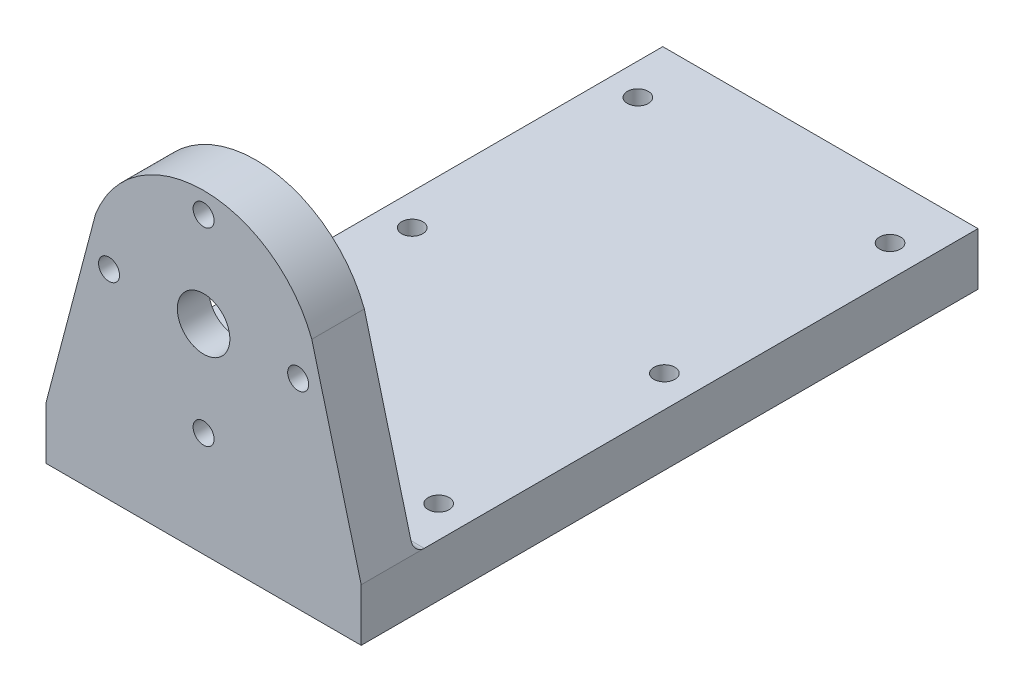
ISO-10303-21;
HEADER;
FILE_DESCRIPTION(('STEP AP214'),'2;1');
FILE_NAME('part.step','',(''),(''),'','','');
FILE_SCHEMA(('AUTOMOTIVE_DESIGN { 1 0 10303 214 1 1 1 1 }'));
ENDSEC;
DATA;
#1=APPLICATION_CONTEXT('core data for automotive mechanical design processes');
#2=APPLICATION_PROTOCOL_DEFINITION('international standard','automotive_design',2000,#1);
#3=PRODUCT_CONTEXT('',#1,'mechanical');
#4=PRODUCT('Part','Part','',(#3));
#5=PRODUCT_RELATED_PRODUCT_CATEGORY('part','',(#4));
#6=PRODUCT_DEFINITION_FORMATION('','',#4);
#7=PRODUCT_DEFINITION_CONTEXT('part definition',#1,'design');
#8=PRODUCT_DEFINITION('design','',#6,#7);
#9=PRODUCT_DEFINITION_SHAPE('','',#8);
#10=(LENGTH_UNIT() NAMED_UNIT(*) SI_UNIT(.MILLI.,.METRE.));
#11=(NAMED_UNIT(*) PLANE_ANGLE_UNIT() SI_UNIT($,.RADIAN.));
#12=(NAMED_UNIT(*) SI_UNIT($,.STERADIAN.) SOLID_ANGLE_UNIT());
#13=UNCERTAINTY_MEASURE_WITH_UNIT(LENGTH_MEASURE(1.E-05),#10,'distance_accuracy_value','');
#14=(GEOMETRIC_REPRESENTATION_CONTEXT(3) GLOBAL_UNCERTAINTY_ASSIGNED_CONTEXT((#13)) GLOBAL_UNIT_ASSIGNED_CONTEXT((#10,
#11,#12)) REPRESENTATION_CONTEXT('',''));
#15=CARTESIAN_POINT('',(0.,0.,0.));
#16=DIRECTION('',(0.,0.,1.));
#17=DIRECTION('',(1.,0.,0.));
#18=AXIS2_PLACEMENT_3D('',#15,#16,#17);
#19=CARTESIAN_POINT('',(15.,19.,-58.7));
#20=DIRECTION('',(0.,0.,1.));
#21=DIRECTION('',(1.,0.,0.));
#22=AXIS2_PLACEMENT_3D('',#19,#20,#21);
#23=CYLINDRICAL_SURFACE('',#22,2.5);
#24=CARTESIAN_POINT('',(15.,19.,0.));
#25=DIRECTION('',(0.,0.,1.));
#26=DIRECTION('',(1.,0.,0.));
#27=AXIS2_PLACEMENT_3D('',#24,#25,#26);
#28=CIRCLE('',#27,2.5);
#29=CARTESIAN_POINT('',(17.5,19.,0.));
#30=VERTEX_POINT('',#29);
#31=EDGE_CURVE('E260',#30,#30,#28,.T.);
#32=ORIENTED_EDGE('',*,*,#31,.T.);
#33=EDGE_LOOP('',(#32));
#34=FACE_BOUND('',#33,.T.);
#35=CARTESIAN_POINT('',(15.,19.,-3.));
#36=DIRECTION('',(0.,0.,-1.));
#37=DIRECTION('',(0.,1.,0.));
#38=AXIS2_PLACEMENT_3D('',#35,#36,#37);
#39=CIRCLE('',#38,2.5);
#40=CARTESIAN_POINT('',(15.,21.5,-3.));
#41=VERTEX_POINT('',#40);
#42=EDGE_CURVE('E308',#41,#41,#39,.F.);
#43=ORIENTED_EDGE('',*,*,#42,.F.);
#44=EDGE_LOOP('',(#43));
#45=FACE_BOUND('',#44,.T.);
#46=ADVANCED_FACE('F179',(#34,#45),#23,.F.);
#47=CARTESIAN_POINT('',(30.,0.,-58.7));
#48=DIRECTION('',(0.,1.,0.));
#49=DIRECTION('',(0.,0.,1.));
#50=AXIS2_PLACEMENT_3D('',#47,#48,#49);
#51=PLANE('',#50);
#52=CARTESIAN_POINT('',(27.,0.,-31.85));
#53=DIRECTION('',(0.,1.,0.));
#54=DIRECTION('',(0.,0.,-1.));
#55=AXIS2_PLACEMENT_3D('',#52,#53,#54);
#56=CIRCLE('',#55,0.999999999999998);
#57=CARTESIAN_POINT('',(27.,0.,-32.85));
#58=VERTEX_POINT('',#57);
#59=EDGE_CURVE('E423',#58,#58,#56,.T.);
#60=ORIENTED_EDGE('',*,*,#59,.T.);
#61=EDGE_LOOP('',(#60));
#62=FACE_BOUND('',#61,.T.);
#63=CARTESIAN_POINT('',(3.,0.,-31.85));
#64=DIRECTION('',(0.,1.,0.));
#65=DIRECTION('',(0.,0.,1.));
#66=AXIS2_PLACEMENT_3D('',#63,#64,#65);
#67=CIRCLE('',#66,0.999999999999999);
#68=CARTESIAN_POINT('',(3.,0.,-30.85));
#69=VERTEX_POINT('',#68);
#70=EDGE_CURVE('E431',#69,#69,#67,.T.);
#71=ORIENTED_EDGE('',*,*,#70,.T.);
#72=EDGE_LOOP('',(#71));
#73=FACE_BOUND('',#72,.T.);
#74=CARTESIAN_POINT('',(3.,0.,-53.33));
#75=DIRECTION('',(0.,1.,0.));
#76=DIRECTION('',(0.,0.,-1.));
#77=AXIS2_PLACEMENT_3D('',#74,#75,#76);
#78=CIRCLE('',#77,1.);
#79=CARTESIAN_POINT('',(3.,0.,-54.33));
#80=VERTEX_POINT('',#79);
#81=EDGE_CURVE('E437',#80,#80,#78,.T.);
#82=ORIENTED_EDGE('',*,*,#81,.T.);
#83=EDGE_LOOP('',(#82));
#84=FACE_BOUND('',#83,.T.);
#85=CARTESIAN_POINT('',(27.,0.,-53.33));
#86=DIRECTION('',(0.,1.,0.));
#87=DIRECTION('',(0.,0.,1.));
#88=AXIS2_PLACEMENT_3D('',#85,#86,#87);
#89=CIRCLE('',#88,0.999999999999998);
#90=CARTESIAN_POINT('',(27.,0.,-52.33));
#91=VERTEX_POINT('',#90);
#92=EDGE_CURVE('E443',#91,#91,#89,.T.);
#93=ORIENTED_EDGE('',*,*,#92,.T.);
#94=EDGE_LOOP('',(#93));
#95=FACE_BOUND('',#94,.T.);
#96=CARTESIAN_POINT('',(27.,0.,-10.37));
#97=DIRECTION('',(0.,1.,0.));
#98=DIRECTION('',(0.,0.,-1.));
#99=AXIS2_PLACEMENT_3D('',#96,#97,#98);
#100=CIRCLE('',#99,0.999999999999998);
#101=CARTESIAN_POINT('',(27.,0.,-11.37));
#102=VERTEX_POINT('',#101);
#103=EDGE_CURVE('E449',#102,#102,#100,.T.);
#104=ORIENTED_EDGE('',*,*,#103,.T.);
#105=EDGE_LOOP('',(#104));
#106=FACE_BOUND('',#105,.T.);
#107=CARTESIAN_POINT('',(3.,0.,-10.37));
#108=DIRECTION('',(0.,1.,0.));
#109=DIRECTION('',(0.,0.,1.));
#110=AXIS2_PLACEMENT_3D('',#107,#108,#109);
#111=CIRCLE('',#110,1.);
#112=CARTESIAN_POINT('',(3.,0.,-9.37));
#113=VERTEX_POINT('',#112);
#114=EDGE_CURVE('E455',#113,#113,#111,.T.);
#115=ORIENTED_EDGE('',*,*,#114,.T.);
#116=EDGE_LOOP('',(#115));
#117=FACE_BOUND('',#116,.T.);
#118=DIRECTION('',(0.,0.,-1.));
#119=VECTOR('',#118,1.);
#120=CARTESIAN_POINT('',(0.,0.,-58.7));
#121=LINE('',#120,#119);
#122=CARTESIAN_POINT('',(0.,0.,0.));
#123=VERTEX_POINT('',#122);
#124=CARTESIAN_POINT('',(0.,0.,-58.7));
#125=VERTEX_POINT('',#124);
#126=EDGE_CURVE('E277',#123,#125,#121,.T.);
#127=ORIENTED_EDGE('',*,*,#126,.T.);
#128=DIRECTION('',(-1.,0.,0.));
#129=VECTOR('',#128,1.);
#130=CARTESIAN_POINT('',(30.,0.,-58.7));
#131=LINE('',#130,#129);
#132=CARTESIAN_POINT('',(30.,0.,-58.7));
#133=VERTEX_POINT('',#132);
#134=EDGE_CURVE('E301',#133,#125,#131,.T.);
#135=ORIENTED_EDGE('',*,*,#134,.F.);
#136=DIRECTION('',(0.,0.,-1.));
#137=VECTOR('',#136,1.);
#138=CARTESIAN_POINT('',(30.,0.,-58.7));
#139=LINE('',#138,#137);
#140=CARTESIAN_POINT('',(30.,0.,0.));
#141=VERTEX_POINT('',#140);
#142=EDGE_CURVE('E278',#141,#133,#139,.T.);
#143=ORIENTED_EDGE('',*,*,#142,.F.);
#144=DIRECTION('',(-1.,0.,0.));
#145=VECTOR('',#144,1.);
#146=CARTESIAN_POINT('',(30.,0.,0.));
#147=LINE('',#146,#145);
#148=EDGE_CURVE('E288',#141,#123,#147,.T.);
#149=ORIENTED_EDGE('',*,*,#148,.T.);
#150=EDGE_LOOP('',(#127,#135,#143,#149));
#151=FACE_BOUND('',#150,.T.);
#152=ADVANCED_FACE('F338',(#62,#73,#84,#95,#106,#117,#151),#51,.F.);
#153=CARTESIAN_POINT('',(30.,5.,-58.7));
#154=DIRECTION('',(0.,0.,1.));
#155=DIRECTION('',(1.,0.,0.));
#156=AXIS2_PLACEMENT_3D('',#153,#154,#155);
#157=PLANE('',#156);
#158=DIRECTION('',(0.,1.,0.));
#159=VECTOR('',#158,1.);
#160=CARTESIAN_POINT('',(0.,5.,-58.7));
#161=LINE('',#160,#159);
#162=CARTESIAN_POINT('',(0.,5.,-58.7));
#163=VERTEX_POINT('',#162);
#164=EDGE_CURVE('E291',#125,#163,#161,.T.);
#165=ORIENTED_EDGE('',*,*,#164,.T.);
#166=DIRECTION('',(-1.,0.,0.));
#167=VECTOR('',#166,1.);
#168=CARTESIAN_POINT('',(30.,5.,-58.7));
#169=LINE('',#168,#167);
#170=CARTESIAN_POINT('',(30.,5.,-58.7));
#171=VERTEX_POINT('',#170);
#172=EDGE_CURVE('E298',#171,#163,#169,.T.);
#173=ORIENTED_EDGE('',*,*,#172,.F.);
#174=DIRECTION('',(0.,1.,0.));
#175=VECTOR('',#174,1.);
#176=CARTESIAN_POINT('',(30.,5.,-58.7));
#177=LINE('',#176,#175);
#178=EDGE_CURVE('E281',#133,#171,#177,.T.);
#179=ORIENTED_EDGE('',*,*,#178,.F.);
#180=ORIENTED_EDGE('',*,*,#134,.T.);
#181=EDGE_LOOP('',(#165,#173,#179,#180));
#182=FACE_BOUND('',#181,.T.);
#183=ADVANCED_FACE('F334',(#182),#157,.F.);
#184=CARTESIAN_POINT('',(30.,5.,-5.));
#185=DIRECTION('',(0.,-1.,0.));
#186=DIRECTION('',(0.,0.,-1.));
#187=AXIS2_PLACEMENT_3D('',#184,#185,#186);
#188=PLANE('',#187);
#189=CARTESIAN_POINT('',(27.,5.,-31.85));
#190=DIRECTION('',(0.,1.,0.));
#191=DIRECTION('',(0.,0.,-1.));
#192=AXIS2_PLACEMENT_3D('',#189,#190,#191);
#193=CIRCLE('',#192,0.999999999999998);
#194=CARTESIAN_POINT('',(27.,5.,-32.85));
#195=VERTEX_POINT('',#194);
#196=EDGE_CURVE('E426',#195,#195,#193,.T.);
#197=ORIENTED_EDGE('',*,*,#196,.F.);
#198=EDGE_LOOP('',(#197));
#199=FACE_BOUND('',#198,.T.);
#200=CARTESIAN_POINT('',(3.,5.,-31.85));
#201=DIRECTION('',(0.,1.,0.));
#202=DIRECTION('',(0.,0.,1.));
#203=AXIS2_PLACEMENT_3D('',#200,#201,#202);
#204=CIRCLE('',#203,0.999999999999999);
#205=CARTESIAN_POINT('',(3.,5.,-30.85));
#206=VERTEX_POINT('',#205);
#207=EDGE_CURVE('E428',#206,#206,#204,.T.);
#208=ORIENTED_EDGE('',*,*,#207,.F.);
#209=EDGE_LOOP('',(#208));
#210=FACE_BOUND('',#209,.T.);
#211=CARTESIAN_POINT('',(3.,5.,-53.33));
#212=DIRECTION('',(0.,1.,0.));
#213=DIRECTION('',(0.,0.,-1.));
#214=AXIS2_PLACEMENT_3D('',#211,#212,#213);
#215=CIRCLE('',#214,1.);
#216=CARTESIAN_POINT('',(3.,5.,-54.33));
#217=VERTEX_POINT('',#216);
#218=EDGE_CURVE('E434',#217,#217,#215,.T.);
#219=ORIENTED_EDGE('',*,*,#218,.F.);
#220=EDGE_LOOP('',(#219));
#221=FACE_BOUND('',#220,.T.);
#222=CARTESIAN_POINT('',(27.,5.,-53.33));
#223=DIRECTION('',(0.,1.,0.));
#224=DIRECTION('',(0.,0.,1.));
#225=AXIS2_PLACEMENT_3D('',#222,#223,#224);
#226=CIRCLE('',#225,0.999999999999998);
#227=CARTESIAN_POINT('',(27.,5.,-52.33));
#228=VERTEX_POINT('',#227);
#229=EDGE_CURVE('E440',#228,#228,#226,.T.);
#230=ORIENTED_EDGE('',*,*,#229,.F.);
#231=EDGE_LOOP('',(#230));
#232=FACE_BOUND('',#231,.T.);
#233=CARTESIAN_POINT('',(27.,5.,-10.37));
#234=DIRECTION('',(0.,1.,0.));
#235=DIRECTION('',(0.,0.,-1.));
#236=AXIS2_PLACEMENT_3D('',#233,#234,#235);
#237=CIRCLE('',#236,0.999999999999998);
#238=CARTESIAN_POINT('',(27.,5.,-11.37));
#239=VERTEX_POINT('',#238);
#240=EDGE_CURVE('E446',#239,#239,#237,.T.);
#241=ORIENTED_EDGE('',*,*,#240,.F.);
#242=EDGE_LOOP('',(#241));
#243=FACE_BOUND('',#242,.T.);
#244=CARTESIAN_POINT('',(3.,5.,-10.37));
#245=DIRECTION('',(0.,1.,0.));
#246=DIRECTION('',(0.,0.,1.));
#247=AXIS2_PLACEMENT_3D('',#244,#245,#246);
#248=CIRCLE('',#247,1.);
#249=CARTESIAN_POINT('',(3.,5.,-9.37));
#250=VERTEX_POINT('',#249);
#251=EDGE_CURVE('E452',#250,#250,#248,.T.);
#252=ORIENTED_EDGE('',*,*,#251,.F.);
#253=EDGE_LOOP('',(#252));
#254=FACE_BOUND('',#253,.T.);
#255=DIRECTION('',(0.,0.,1.));
#256=VECTOR('',#255,1.);
#257=CARTESIAN_POINT('',(0.,5.,-5.));
#258=LINE('',#257,#256);
#259=CARTESIAN_POINT('',(0.,5.,-6.));
#260=VERTEX_POINT('',#259);
#261=EDGE_CURVE('E293',#163,#260,#258,.T.);
#262=ORIENTED_EDGE('',*,*,#261,.T.);
#263=DIRECTION('',(-1.,0.,0.));
#264=VECTOR('',#263,1.);
#265=CARTESIAN_POINT('',(30.,5.,-6.));
#266=LINE('',#265,#264);
#267=CARTESIAN_POINT('',(30.,4.99999999999999,-6.));
#268=VERTEX_POINT('',#267);
#269=EDGE_CURVE('E315',#260,#268,#266,.F.);
#270=ORIENTED_EDGE('',*,*,#269,.T.);
#271=DIRECTION('',(0.,0.,1.));
#272=VECTOR('',#271,1.);
#273=CARTESIAN_POINT('',(30.,5.,-5.));
#274=LINE('',#273,#272);
#275=EDGE_CURVE('E284',#171,#268,#274,.T.);
#276=ORIENTED_EDGE('',*,*,#275,.F.);
#277=ORIENTED_EDGE('',*,*,#172,.T.);
#278=EDGE_LOOP('',(#262,#270,#276,#277));
#279=FACE_BOUND('',#278,.T.);
#280=ADVANCED_FACE('F327',(#199,#210,#221,#232,#243,#254,#279),#188,.F.);
#281=CARTESIAN_POINT('',(30.,30.,-5.));
#282=DIRECTION('',(0.,0.,1.));
#283=DIRECTION('',(0.,-1.,0.));
#284=AXIS2_PLACEMENT_3D('',#281,#282,#283);
#285=PLANE('',#284);
#286=CARTESIAN_POINT('',(15.,19.,-5.));
#287=DIRECTION('',(0.,0.,-1.));
#288=DIRECTION('',(0.,1.,0.));
#289=AXIS2_PLACEMENT_3D('',#286,#287,#288);
#290=CIRCLE('',#289,7.);
#291=CARTESIAN_POINT('',(15.,26.,-5.));
#292=VERTEX_POINT('',#291);
#293=EDGE_CURVE('E458',#292,#292,#290,.T.);
#294=ORIENTED_EDGE('',*,*,#293,.F.);
#295=EDGE_LOOP('',(#294));
#296=FACE_BOUND('',#295,.T.);
#297=CARTESIAN_POINT('',(15.,28.,-5.));
#298=DIRECTION('',(0.,0.,1.));
#299=DIRECTION('',(0.,-1.,0.));
#300=AXIS2_PLACEMENT_3D('',#297,#298,#299);
#301=CIRCLE('',#300,1.);
#302=CARTESIAN_POINT('',(15.,27.,-5.));
#303=VERTEX_POINT('',#302);
#304=EDGE_CURVE('E467',#303,#303,#301,.T.);
#305=ORIENTED_EDGE('',*,*,#304,.T.);
#306=EDGE_LOOP('',(#305));
#307=FACE_BOUND('',#306,.T.);
#308=CARTESIAN_POINT('',(6.00000000000013,19.,-5.));
#309=DIRECTION('',(0.,0.,1.));
#310=DIRECTION('',(0.,-1.,0.));
#311=AXIS2_PLACEMENT_3D('',#308,#309,#310);
#312=CIRCLE('',#311,1.);
#313=CARTESIAN_POINT('',(6.00000000000013,18.,-5.));
#314=VERTEX_POINT('',#313);
#315=EDGE_CURVE('E473',#314,#314,#312,.T.);
#316=ORIENTED_EDGE('',*,*,#315,.T.);
#317=EDGE_LOOP('',(#316));
#318=FACE_BOUND('',#317,.T.);
#319=CARTESIAN_POINT('',(15.0000000000002,10.,-5.));
#320=DIRECTION('',(0.,0.,1.));
#321=DIRECTION('',(0.,-1.,0.));
#322=AXIS2_PLACEMENT_3D('',#319,#320,#321);
#323=CIRCLE('',#322,1.);
#324=CARTESIAN_POINT('',(15.0000000000002,9.,-5.));
#325=VERTEX_POINT('',#324);
#326=EDGE_CURVE('E479',#325,#325,#323,.T.);
#327=ORIENTED_EDGE('',*,*,#326,.T.);
#328=EDGE_LOOP('',(#327));
#329=FACE_BOUND('',#328,.T.);
#330=CARTESIAN_POINT('',(24.0000000000001,19.0000000000001,-5.));
#331=DIRECTION('',(0.,0.,1.));
#332=DIRECTION('',(0.,-1.,0.));
#333=AXIS2_PLACEMENT_3D('',#330,#331,#332);
#334=CIRCLE('',#333,1.);
#335=CARTESIAN_POINT('',(24.0000000000001,18.0000000000001,-5.));
#336=VERTEX_POINT('',#335);
#337=EDGE_CURVE('E484',#336,#336,#334,.T.);
#338=ORIENTED_EDGE('',*,*,#337,.T.);
#339=EDGE_LOOP('',(#338));
#340=FACE_BOUND('',#339,.T.);
#341=DIRECTION('',(0.254565181733984,-0.967055617970727,0.));
#342=VECTOR('',#341,1.);
#343=CARTESIAN_POINT('',(23.8455327716103,28.3799142062186,-5.));
#344=LINE('',#343,#342);
#345=CARTESIAN_POINT('',(25.2940757121617,22.8771130022586,-5.));
#346=VERTEX_POINT('',#345);
#347=CARTESIAN_POINT('',(29.7367626256407,5.99999999999999,-5.));
#348=VERTEX_POINT('',#347);
#349=EDGE_CURVE('E259',#346,#348,#344,.T.);
#350=ORIENTED_EDGE('',*,*,#349,.T.);
#351=DIRECTION('',(-1.,0.,0.));
#352=VECTOR('',#351,1.);
#353=CARTESIAN_POINT('',(0.,6.,-5.));
#354=LINE('',#353,#352);
#355=CARTESIAN_POINT('',(0.263237374359255,5.99999999999998,-5.));
#356=VERTEX_POINT('',#355);
#357=EDGE_CURVE('E307',#348,#356,#354,.T.);
#358=ORIENTED_EDGE('',*,*,#357,.T.);
#359=DIRECTION('',(0.254565181733984,0.967055617970727,0.));
#360=VECTOR('',#359,1.);
#361=CARTESIAN_POINT('',(8.09857018092738,35.7652748802862,-5.));
#362=LINE('',#361,#360);
#363=CARTESIAN_POINT('',(4.7059242878383,22.8771130022586,-5.));
#364=VERTEX_POINT('',#363);
#365=EDGE_CURVE('E273',#356,#364,#362,.T.);
#366=ORIENTED_EDGE('',*,*,#365,.T.);
#367=CARTESIAN_POINT('',(15.,19.,-5.));
#368=DIRECTION('',(0.,0.,1.));
#369=DIRECTION('',(0.,-1.,0.));
#370=AXIS2_PLACEMENT_3D('',#367,#368,#369);
#371=CIRCLE('',#370,11.);
#372=EDGE_CURVE('E275',#364,#346,#371,.F.);
#373=ORIENTED_EDGE('',*,*,#372,.T.);
#374=EDGE_LOOP('',(#350,#358,#366,#373));
#375=FACE_BOUND('',#374,.T.);
#376=ADVANCED_FACE('F353',(#296,#307,#318,#329,#340,#375),#285,.F.);
#377=CARTESIAN_POINT('',(30.,0.,0.));
#378=DIRECTION('',(0.,0.,-1.));
#379=DIRECTION('',(-1.,0.,0.));
#380=AXIS2_PLACEMENT_3D('',#377,#378,#379);
#381=PLANE('',#380);
#382=CARTESIAN_POINT('',(15.,28.,0.));
#383=DIRECTION('',(0.,0.,1.));
#384=DIRECTION('',(1.,0.,0.));
#385=AXIS2_PLACEMENT_3D('',#382,#383,#384);
#386=CIRCLE('',#385,1.);
#387=CARTESIAN_POINT('',(16.,28.,0.));
#388=VERTEX_POINT('',#387);
#389=EDGE_CURVE('E311',#388,#388,#386,.T.);
#390=ORIENTED_EDGE('',*,*,#389,.F.);
#391=EDGE_LOOP('',(#390));
#392=FACE_BOUND('',#391,.T.);
#393=CARTESIAN_POINT('',(6.00000000000013,19.,0.));
#394=DIRECTION('',(0.,0.,1.));
#395=DIRECTION('',(1.,0.,0.));
#396=AXIS2_PLACEMENT_3D('',#393,#394,#395);
#397=CIRCLE('',#396,1.);
#398=CARTESIAN_POINT('',(7.00000000000013,19.,0.));
#399=VERTEX_POINT('',#398);
#400=EDGE_CURVE('E470',#399,#399,#397,.T.);
#401=ORIENTED_EDGE('',*,*,#400,.F.);
#402=EDGE_LOOP('',(#401));
#403=FACE_BOUND('',#402,.T.);
#404=CARTESIAN_POINT('',(15.0000000000002,10.,0.));
#405=DIRECTION('',(0.,0.,1.));
#406=DIRECTION('',(1.,0.,0.));
#407=AXIS2_PLACEMENT_3D('',#404,#405,#406);
#408=CIRCLE('',#407,1.);
#409=CARTESIAN_POINT('',(16.0000000000002,10.,0.));
#410=VERTEX_POINT('',#409);
#411=EDGE_CURVE('E476',#410,#410,#408,.T.);
#412=ORIENTED_EDGE('',*,*,#411,.F.);
#413=EDGE_LOOP('',(#412));
#414=FACE_BOUND('',#413,.T.);
#415=CARTESIAN_POINT('',(24.0000000000001,19.0000000000001,0.));
#416=DIRECTION('',(0.,0.,1.));
#417=DIRECTION('',(1.,0.,0.));
#418=AXIS2_PLACEMENT_3D('',#415,#416,#417);
#419=CIRCLE('',#418,1.);
#420=CARTESIAN_POINT('',(25.0000000000001,19.0000000000001,0.));
#421=VERTEX_POINT('',#420);
#422=EDGE_CURVE('E482',#421,#421,#419,.T.);
#423=ORIENTED_EDGE('',*,*,#422,.F.);
#424=EDGE_LOOP('',(#423));
#425=FACE_BOUND('',#424,.T.);
#426=ORIENTED_EDGE('',*,*,#31,.F.);
#427=EDGE_LOOP('',(#426));
#428=FACE_BOUND('',#427,.T.);
#429=DIRECTION('',(0.,-1.,0.));
#430=VECTOR('',#429,1.);
#431=CARTESIAN_POINT('',(30.,0.,0.));
#432=LINE('',#431,#430);
#433=CARTESIAN_POINT('',(30.,4.99999999999996,0.));
#434=VERTEX_POINT('',#433);
#435=EDGE_CURVE('E265',#434,#141,#432,.T.);
#436=ORIENTED_EDGE('',*,*,#435,.F.);
#437=DIRECTION('',(0.254565181733984,-0.967055617970727,0.));
#438=VECTOR('',#437,1.);
#439=CARTESIAN_POINT('',(34.724873297944,-12.9490974997175,0.));
#440=LINE('',#439,#438);
#441=CARTESIAN_POINT('',(25.2940757121617,22.8771130022586,0.));
#442=VERTEX_POINT('',#441);
#443=EDGE_CURVE('E256',#442,#434,#440,.T.);
#444=ORIENTED_EDGE('',*,*,#443,.F.);
#445=CARTESIAN_POINT('',(15.,19.,0.));
#446=DIRECTION('',(0.,0.,1.));
#447=DIRECTION('',(1.,0.,0.));
#448=AXIS2_PLACEMENT_3D('',#445,#446,#447);
#449=CIRCLE('',#448,11.);
#450=CARTESIAN_POINT('',(4.7059242878383,22.8771130022586,0.));
#451=VERTEX_POINT('',#450);
#452=EDGE_CURVE('E240',#451,#442,#449,.F.);
#453=ORIENTED_EDGE('',*,*,#452,.F.);
#454=DIRECTION('',(0.254565181733984,0.967055617970727,0.));
#455=VECTOR('',#454,1.);
#456=CARTESIAN_POINT('',(-4.72487329794396,-12.9490974997175,0.));
#457=LINE('',#456,#455);
#458=CARTESIAN_POINT('',(0.,4.99999999999998,0.));
#459=VERTEX_POINT('',#458);
#460=EDGE_CURVE('E251',#459,#451,#457,.T.);
#461=ORIENTED_EDGE('',*,*,#460,.F.);
#462=DIRECTION('',(0.,-1.,0.));
#463=VECTOR('',#462,1.);
#464=CARTESIAN_POINT('',(0.,0.,0.));
#465=LINE('',#464,#463);
#466=EDGE_CURVE('E282',#459,#123,#465,.T.);
#467=ORIENTED_EDGE('',*,*,#466,.T.);
#468=ORIENTED_EDGE('',*,*,#148,.F.);
#469=EDGE_LOOP('',(#436,#444,#453,#461,#467,#468));
#470=FACE_BOUND('',#469,.T.);
#471=ADVANCED_FACE('F263',(#392,#403,#414,#425,#428,#470),#381,.F.);
#472=CARTESIAN_POINT('',(30.,0.,0.));
#473=DIRECTION('',(-1.,0.,0.));
#474=DIRECTION('',(0.,0.,1.));
#475=AXIS2_PLACEMENT_3D('',#472,#473,#474);
#476=PLANE('',#475);
#477=ORIENTED_EDGE('',*,*,#275,.T.);
#478=DIRECTION('',(0.,0.,1.));
#479=VECTOR('',#478,1.);
#480=CARTESIAN_POINT('',(30.,4.99999999999999,0.));
#481=LINE('',#480,#479);
#482=EDGE_CURVE('E305',#268,#434,#481,.T.);
#483=ORIENTED_EDGE('',*,*,#482,.T.);
#484=ORIENTED_EDGE('',*,*,#435,.T.);
#485=ORIENTED_EDGE('',*,*,#142,.T.);
#486=ORIENTED_EDGE('',*,*,#178,.T.);
#487=EDGE_LOOP('',(#477,#483,#484,#485,#486));
#488=FACE_BOUND('',#487,.T.);
#489=ADVANCED_FACE('F329',(#488),#476,.F.);
#490=CARTESIAN_POINT('',(0.,0.,0.));
#491=DIRECTION('',(-1.,0.,0.));
#492=DIRECTION('',(0.,0.,1.));
#493=AXIS2_PLACEMENT_3D('',#490,#491,#492);
#494=PLANE('',#493);
#495=DIRECTION('',(0.,0.,1.));
#496=VECTOR('',#495,1.);
#497=CARTESIAN_POINT('',(0.,5.,0.));
#498=LINE('',#497,#496);
#499=EDGE_CURVE('E194',#260,#459,#498,.T.);
#500=ORIENTED_EDGE('',*,*,#499,.F.);
#501=ORIENTED_EDGE('',*,*,#261,.F.);
#502=ORIENTED_EDGE('',*,*,#164,.F.);
#503=ORIENTED_EDGE('',*,*,#126,.F.);
#504=ORIENTED_EDGE('',*,*,#466,.F.);
#505=EDGE_LOOP('',(#500,#501,#502,#503,#504));
#506=FACE_BOUND('',#505,.T.);
#507=ADVANCED_FACE('F335',(#506),#494,.T.);
#508=CARTESIAN_POINT('',(15.,19.,-58.7));
#509=DIRECTION('',(0.,0.,1.));
#510=DIRECTION('',(1.,0.,0.));
#511=AXIS2_PLACEMENT_3D('',#508,#509,#510);
#512=CYLINDRICAL_SURFACE('',#511,11.);
#513=DIRECTION('',(0.,0.,1.));
#514=VECTOR('',#513,1.);
#515=CARTESIAN_POINT('',(4.7059242878383,22.8771130022586,-58.7));
#516=LINE('',#515,#514);
#517=EDGE_CURVE('E246',#364,#451,#516,.T.);
#518=ORIENTED_EDGE('',*,*,#517,.T.);
#519=ORIENTED_EDGE('',*,*,#452,.T.);
#520=DIRECTION('',(0.,0.,1.));
#521=VECTOR('',#520,1.);
#522=CARTESIAN_POINT('',(25.2940757121617,22.8771130022586,-58.7));
#523=LINE('',#522,#521);
#524=EDGE_CURVE('E244',#346,#442,#523,.T.);
#525=ORIENTED_EDGE('',*,*,#524,.F.);
#526=ORIENTED_EDGE('',*,*,#372,.F.);
#527=EDGE_LOOP('',(#518,#519,#525,#526));
#528=FACE_BOUND('',#527,.T.);
#529=ADVANCED_FACE('F242',(#528),#512,.T.);
#530=CARTESIAN_POINT('',(-4.72487329794396,-12.9490974997175,-58.7));
#531=DIRECTION('',(0.967055617970726,-0.254565181733984,0.));
#532=DIRECTION('',(0.254565181733984,0.967055617970727,0.));
#533=AXIS2_PLACEMENT_3D('',#530,#531,#532);
#534=PLANE('',#533);
#535=ORIENTED_EDGE('',*,*,#499,.T.);
#536=ORIENTED_EDGE('',*,*,#460,.T.);
#537=ORIENTED_EDGE('',*,*,#517,.F.);
#538=ORIENTED_EDGE('',*,*,#365,.F.);
#539=CARTESIAN_POINT('',(0.263237374359258,6.,-6.));
#540=DIRECTION('',(0.967055617970726,-0.254565181733984,0.));
#541=DIRECTION('',(0.254565181733984,0.967055617970727,0.));
#542=AXIS2_PLACEMENT_3D('',#539,#540,#541);
#543=ELLIPSE('',#542,1.03406668801367,1.);
#544=EDGE_CURVE('E188',#356,#260,#543,.T.);
#545=ORIENTED_EDGE('',*,*,#544,.T.);
#546=EDGE_LOOP('',(#535,#536,#537,#538,#545));
#547=FACE_BOUND('',#546,.T.);
#548=ADVANCED_FACE('F321',(#547),#534,.F.);
#549=CARTESIAN_POINT('',(34.724873297944,-12.9490974997175,-58.7));
#550=DIRECTION('',(-0.967055617970726,-0.254565181733984,0.));
#551=DIRECTION('',(0.254565181733984,-0.967055617970727,0.));
#552=AXIS2_PLACEMENT_3D('',#549,#550,#551);
#553=PLANE('',#552);
#554=ORIENTED_EDGE('',*,*,#524,.T.);
#555=ORIENTED_EDGE('',*,*,#443,.T.);
#556=ORIENTED_EDGE('',*,*,#482,.F.);
#557=CARTESIAN_POINT('',(29.7367626256407,6.,-6.));
#558=DIRECTION('',(-0.967055617970726,-0.254565181733984,0.));
#559=DIRECTION('',(0.254565181733984,-0.967055617970727,0.));
#560=AXIS2_PLACEMENT_3D('',#557,#558,#559);
#561=ELLIPSE('',#560,1.03406668801367,1.);
#562=EDGE_CURVE('E12',#268,#348,#561,.T.);
#563=ORIENTED_EDGE('',*,*,#562,.T.);
#564=ORIENTED_EDGE('',*,*,#349,.F.);
#565=EDGE_LOOP('',(#554,#555,#556,#563,#564));
#566=FACE_BOUND('',#565,.T.);
#567=ADVANCED_FACE('F255',(#566),#553,.F.);
#568=CARTESIAN_POINT('',(24.0000000000001,19.0000000000001,-58.7));
#569=DIRECTION('',(0.,0.,1.));
#570=DIRECTION('',(1.,0.,0.));
#571=AXIS2_PLACEMENT_3D('',#568,#569,#570);
#572=CYLINDRICAL_SURFACE('',#571,1.);
#573=ORIENTED_EDGE('',*,*,#422,.T.);
#574=EDGE_LOOP('',(#573));
#575=FACE_BOUND('',#574,.T.);
#576=ORIENTED_EDGE('',*,*,#337,.F.);
#577=EDGE_LOOP('',(#576));
#578=FACE_BOUND('',#577,.T.);
#579=ADVANCED_FACE('F370',(#575,#578),#572,.F.);
#580=CARTESIAN_POINT('',(15.0000000000002,10.,-58.7));
#581=DIRECTION('',(0.,0.,1.));
#582=DIRECTION('',(1.,0.,0.));
#583=AXIS2_PLACEMENT_3D('',#580,#581,#582);
#584=CYLINDRICAL_SURFACE('',#583,1.);
#585=ORIENTED_EDGE('',*,*,#411,.T.);
#586=EDGE_LOOP('',(#585));
#587=FACE_BOUND('',#586,.T.);
#588=ORIENTED_EDGE('',*,*,#326,.F.);
#589=EDGE_LOOP('',(#588));
#590=FACE_BOUND('',#589,.T.);
#591=ADVANCED_FACE('F374',(#587,#590),#584,.F.);
#592=CARTESIAN_POINT('',(6.00000000000013,19.,-58.7));
#593=DIRECTION('',(0.,0.,1.));
#594=DIRECTION('',(1.,0.,0.));
#595=AXIS2_PLACEMENT_3D('',#592,#593,#594);
#596=CYLINDRICAL_SURFACE('',#595,1.);
#597=ORIENTED_EDGE('',*,*,#400,.T.);
#598=EDGE_LOOP('',(#597));
#599=FACE_BOUND('',#598,.T.);
#600=ORIENTED_EDGE('',*,*,#315,.F.);
#601=EDGE_LOOP('',(#600));
#602=FACE_BOUND('',#601,.T.);
#603=ADVANCED_FACE('F378',(#599,#602),#596,.F.);
#604=CARTESIAN_POINT('',(15.,28.,-58.7));
#605=DIRECTION('',(0.,0.,1.));
#606=DIRECTION('',(1.,0.,0.));
#607=AXIS2_PLACEMENT_3D('',#604,#605,#606);
#608=CYLINDRICAL_SURFACE('',#607,1.);
#609=ORIENTED_EDGE('',*,*,#389,.T.);
#610=EDGE_LOOP('',(#609));
#611=FACE_BOUND('',#610,.T.);
#612=ORIENTED_EDGE('',*,*,#304,.F.);
#613=EDGE_LOOP('',(#612));
#614=FACE_BOUND('',#613,.T.);
#615=ADVANCED_FACE('F382',(#611,#614),#608,.F.);
#616=CARTESIAN_POINT('',(15.,19.,-3.));
#617=DIRECTION('',(0.,0.,-1.));
#618=DIRECTION('',(0.,1.,0.));
#619=AXIS2_PLACEMENT_3D('',#616,#617,#618);
#620=PLANE('',#619);
#621=CARTESIAN_POINT('',(15.,19.,-3.));
#622=DIRECTION('',(0.,0.,-1.));
#623=DIRECTION('',(0.,1.,0.));
#624=AXIS2_PLACEMENT_3D('',#621,#622,#623);
#625=CIRCLE('',#624,7.);
#626=CARTESIAN_POINT('',(15.,26.,-3.));
#627=VERTEX_POINT('',#626);
#628=EDGE_CURVE('E312',#627,#627,#625,.T.);
#629=ORIENTED_EDGE('',*,*,#628,.T.);
#630=EDGE_LOOP('',(#629));
#631=FACE_BOUND('',#630,.T.);
#632=ORIENTED_EDGE('',*,*,#42,.T.);
#633=EDGE_LOOP('',(#632));
#634=FACE_BOUND('',#633,.T.);
#635=ADVANCED_FACE('F386',(#631,#634),#620,.T.);
#636=CARTESIAN_POINT('',(15.,19.,-3.));
#637=DIRECTION('',(0.,0.,-1.));
#638=DIRECTION('',(0.,1.,0.));
#639=AXIS2_PLACEMENT_3D('',#636,#637,#638);
#640=CYLINDRICAL_SURFACE('',#639,7.);
#641=ORIENTED_EDGE('',*,*,#628,.F.);
#642=EDGE_LOOP('',(#641));
#643=FACE_BOUND('',#642,.T.);
#644=ORIENTED_EDGE('',*,*,#293,.T.);
#645=EDGE_LOOP('',(#644));
#646=FACE_BOUND('',#645,.T.);
#647=ADVANCED_FACE('F388',(#643,#646),#640,.F.);
#648=CARTESIAN_POINT('',(3.,0.,-10.37));
#649=DIRECTION('',(0.,1.,0.));
#650=DIRECTION('',(0.,0.,1.));
#651=AXIS2_PLACEMENT_3D('',#648,#649,#650);
#652=CYLINDRICAL_SURFACE('',#651,1.);
#653=ORIENTED_EDGE('',*,*,#114,.F.);
#654=EDGE_LOOP('',(#653));
#655=FACE_BOUND('',#654,.T.);
#656=ORIENTED_EDGE('',*,*,#251,.T.);
#657=EDGE_LOOP('',(#656));
#658=FACE_BOUND('',#657,.T.);
#659=ADVANCED_FACE('F391',(#655,#658),#652,.F.);
#660=CARTESIAN_POINT('',(27.,0.,-10.37));
#661=DIRECTION('',(0.,1.,0.));
#662=DIRECTION('',(0.,0.,1.));
#663=AXIS2_PLACEMENT_3D('',#660,#661,#662);
#664=CYLINDRICAL_SURFACE('',#663,0.999999999999998);
#665=ORIENTED_EDGE('',*,*,#103,.F.);
#666=EDGE_LOOP('',(#665));
#667=FACE_BOUND('',#666,.T.);
#668=ORIENTED_EDGE('',*,*,#240,.T.);
#669=EDGE_LOOP('',(#668));
#670=FACE_BOUND('',#669,.T.);
#671=ADVANCED_FACE('F398',(#667,#670),#664,.F.);
#672=CARTESIAN_POINT('',(27.,0.,-53.33));
#673=DIRECTION('',(0.,1.,0.));
#674=DIRECTION('',(0.,0.,1.));
#675=AXIS2_PLACEMENT_3D('',#672,#673,#674);
#676=CYLINDRICAL_SURFACE('',#675,0.999999999999998);
#677=ORIENTED_EDGE('',*,*,#92,.F.);
#678=EDGE_LOOP('',(#677));
#679=FACE_BOUND('',#678,.T.);
#680=ORIENTED_EDGE('',*,*,#229,.T.);
#681=EDGE_LOOP('',(#680));
#682=FACE_BOUND('',#681,.T.);
#683=ADVANCED_FACE('F402',(#679,#682),#676,.F.);
#684=CARTESIAN_POINT('',(3.,0.,-53.33));
#685=DIRECTION('',(0.,1.,0.));
#686=DIRECTION('',(0.,0.,1.));
#687=AXIS2_PLACEMENT_3D('',#684,#685,#686);
#688=CYLINDRICAL_SURFACE('',#687,1.);
#689=ORIENTED_EDGE('',*,*,#81,.F.);
#690=EDGE_LOOP('',(#689));
#691=FACE_BOUND('',#690,.T.);
#692=ORIENTED_EDGE('',*,*,#218,.T.);
#693=EDGE_LOOP('',(#692));
#694=FACE_BOUND('',#693,.T.);
#695=ADVANCED_FACE('F406',(#691,#694),#688,.F.);
#696=CARTESIAN_POINT('',(3.,0.,-31.85));
#697=DIRECTION('',(0.,1.,0.));
#698=DIRECTION('',(0.,0.,1.));
#699=AXIS2_PLACEMENT_3D('',#696,#697,#698);
#700=CYLINDRICAL_SURFACE('',#699,0.999999999999999);
#701=ORIENTED_EDGE('',*,*,#70,.F.);
#702=EDGE_LOOP('',(#701));
#703=FACE_BOUND('',#702,.T.);
#704=ORIENTED_EDGE('',*,*,#207,.T.);
#705=EDGE_LOOP('',(#704));
#706=FACE_BOUND('',#705,.T.);
#707=ADVANCED_FACE('F410',(#703,#706),#700,.F.);
#708=CARTESIAN_POINT('',(27.,0.,-31.85));
#709=DIRECTION('',(0.,1.,0.));
#710=DIRECTION('',(0.,0.,1.));
#711=AXIS2_PLACEMENT_3D('',#708,#709,#710);
#712=CYLINDRICAL_SURFACE('',#711,0.999999999999998);
#713=ORIENTED_EDGE('',*,*,#59,.F.);
#714=EDGE_LOOP('',(#713));
#715=FACE_BOUND('',#714,.T.);
#716=ORIENTED_EDGE('',*,*,#196,.T.);
#717=EDGE_LOOP('',(#716));
#718=FACE_BOUND('',#717,.T.);
#719=ADVANCED_FACE('F414',(#715,#718),#712,.F.);
#720=CARTESIAN_POINT('',(30.,6.,-6.));
#721=DIRECTION('',(1.,0.,0.));
#722=DIRECTION('',(0.,0.,-1.));
#723=AXIS2_PLACEMENT_3D('',#720,#721,#722);
#724=CYLINDRICAL_SURFACE('',#723,1.);
#725=ORIENTED_EDGE('',*,*,#562,.F.);
#726=ORIENTED_EDGE('',*,*,#269,.F.);
#727=ORIENTED_EDGE('',*,*,#544,.F.);
#728=ORIENTED_EDGE('',*,*,#357,.F.);
#729=EDGE_LOOP('',(#725,#726,#727,#728));
#730=FACE_BOUND('',#729,.T.);
#731=ADVANCED_FACE('F181',(#730),#724,.F.);
#732=CLOSED_SHELL('',(#46,#152,#183,#280,#376,#471,#489,#507,#529,#548,#567,#579,#591,#603,#615,
#635,#647,#659,#671,#683,#695,#707,#719,#731));
#733=MANIFOLD_SOLID_BREP('B2',#732);
#734=ADVANCED_BREP_SHAPE_REPRESENTATION('',(#18,#733),#14);
#735=SHAPE_DEFINITION_REPRESENTATION(#9,#734);
ENDSEC;
END-ISO-10303-21;
